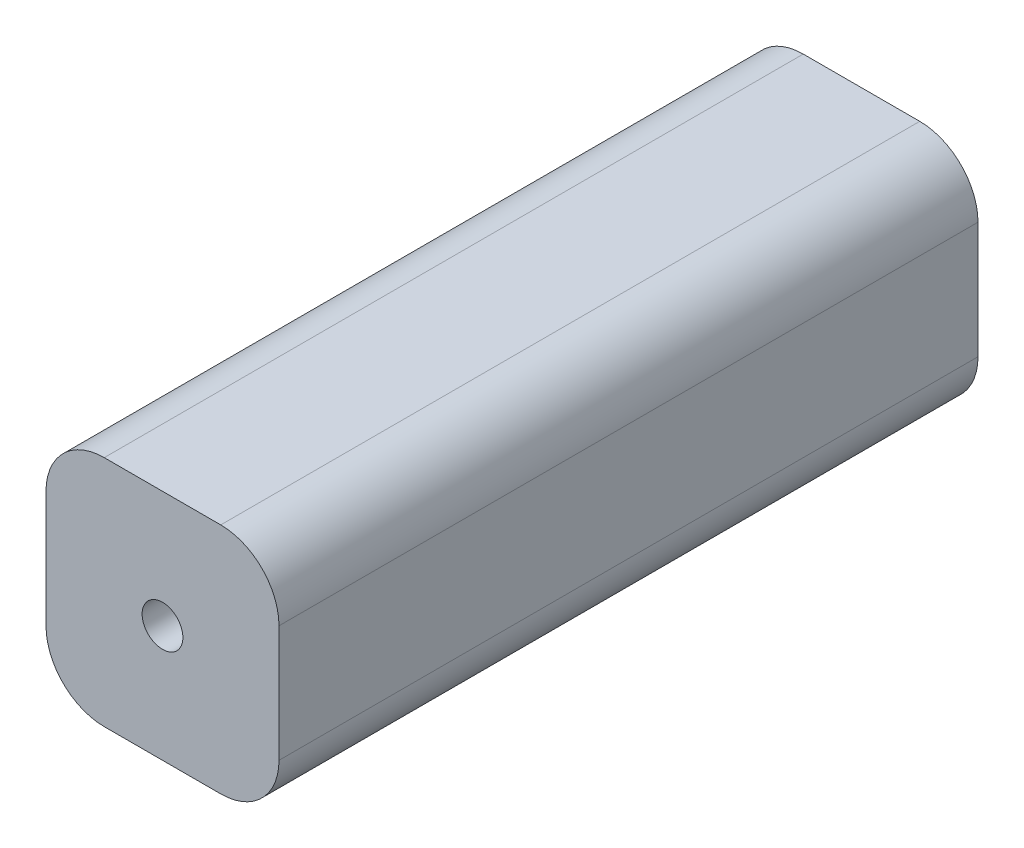
ISO-10303-21;
HEADER;
FILE_DESCRIPTION(('STEP AP214'),'2;1');
FILE_NAME('part.step','',(''),(''),'','','');
FILE_SCHEMA(('AUTOMOTIVE_DESIGN { 1 0 10303 214 1 1 1 1 }'));
ENDSEC;
DATA;
#1=APPLICATION_CONTEXT('core data for automotive mechanical design processes');
#2=APPLICATION_PROTOCOL_DEFINITION('international standard','automotive_design',2000,#1);
#3=PRODUCT_CONTEXT('',#1,'mechanical');
#4=PRODUCT('Part','Part','',(#3));
#5=PRODUCT_RELATED_PRODUCT_CATEGORY('part','',(#4));
#6=PRODUCT_DEFINITION_FORMATION('','',#4);
#7=PRODUCT_DEFINITION_CONTEXT('part definition',#1,'design');
#8=PRODUCT_DEFINITION('design','',#6,#7);
#9=PRODUCT_DEFINITION_SHAPE('','',#8);
#10=(LENGTH_UNIT() NAMED_UNIT(*) SI_UNIT(.MILLI.,.METRE.));
#11=(NAMED_UNIT(*) PLANE_ANGLE_UNIT() SI_UNIT($,.RADIAN.));
#12=(NAMED_UNIT(*) SI_UNIT($,.STERADIAN.) SOLID_ANGLE_UNIT());
#13=UNCERTAINTY_MEASURE_WITH_UNIT(LENGTH_MEASURE(1.E-05),#10,'distance_accuracy_value','');
#14=(GEOMETRIC_REPRESENTATION_CONTEXT(3) GLOBAL_UNCERTAINTY_ASSIGNED_CONTEXT((#13)) GLOBAL_UNIT_ASSIGNED_CONTEXT((#10,
#11,#12)) REPRESENTATION_CONTEXT('',''));
#15=CARTESIAN_POINT('',(0.,0.,0.));
#16=DIRECTION('',(0.,0.,1.));
#17=DIRECTION('',(1.,0.,0.));
#18=AXIS2_PLACEMENT_3D('',#15,#16,#17);
#19=CARTESIAN_POINT('',(0.,0.,60.));
#20=DIRECTION('',(-1.,0.,0.));
#21=DIRECTION('',(0.,0.,1.));
#22=AXIS2_PLACEMENT_3D('',#19,#20,#21);
#23=PLANE('',#22);
#24=DIRECTION('',(0.,1.,0.));
#25=VECTOR('',#24,1.);
#26=CARTESIAN_POINT('',(0.,0.,60.));
#27=LINE('',#26,#25);
#28=CARTESIAN_POINT('',(0.,5.,60.));
#29=VERTEX_POINT('',#28);
#30=CARTESIAN_POINT('',(0.,15.,60.));
#31=VERTEX_POINT('',#30);
#32=EDGE_CURVE('E126',#29,#31,#27,.T.);
#33=ORIENTED_EDGE('',*,*,#32,.F.);
#34=DIRECTION('',(0.,0.,-1.));
#35=VECTOR('',#34,1.);
#36=CARTESIAN_POINT('',(0.,5.,60.));
#37=LINE('',#36,#35);
#38=CARTESIAN_POINT('',(0.,5.,0.));
#39=VERTEX_POINT('',#38);
#40=EDGE_CURVE('E152',#29,#39,#37,.T.);
#41=ORIENTED_EDGE('',*,*,#40,.T.);
#42=DIRECTION('',(0.,1.,0.));
#43=VECTOR('',#42,1.);
#44=CARTESIAN_POINT('',(0.,0.,0.));
#45=LINE('',#44,#43);
#46=CARTESIAN_POINT('',(0.,15.,0.));
#47=VERTEX_POINT('',#46);
#48=EDGE_CURVE('E158',#39,#47,#45,.T.);
#49=ORIENTED_EDGE('',*,*,#48,.T.);
#50=DIRECTION('',(0.,0.,-1.));
#51=VECTOR('',#50,1.);
#52=CARTESIAN_POINT('',(0.,15.,60.));
#53=LINE('',#52,#51);
#54=EDGE_CURVE('E150',#47,#31,#53,.F.);
#55=ORIENTED_EDGE('',*,*,#54,.T.);
#56=EDGE_LOOP('',(#33,#41,#49,#55));
#57=FACE_BOUND('',#56,.T.);
#58=ADVANCED_FACE('F34',(#57),#23,.F.);
#59=CARTESIAN_POINT('',(0.,20.,60.));
#60=DIRECTION('',(0.,-1.,0.));
#61=DIRECTION('',(0.,0.,-1.));
#62=AXIS2_PLACEMENT_3D('',#59,#60,#61);
#63=PLANE('',#62);
#64=DIRECTION('',(-1.,0.,0.));
#65=VECTOR('',#64,1.);
#66=CARTESIAN_POINT('',(0.,20.,60.));
#67=LINE('',#66,#65);
#68=CARTESIAN_POINT('',(-5.,20.,60.));
#69=VERTEX_POINT('',#68);
#70=CARTESIAN_POINT('',(-15.,20.,60.));
#71=VERTEX_POINT('',#70);
#72=EDGE_CURVE('E129',#69,#71,#67,.T.);
#73=ORIENTED_EDGE('',*,*,#72,.F.);
#74=DIRECTION('',(0.,0.,-1.));
#75=VECTOR('',#74,1.);
#76=CARTESIAN_POINT('',(-5.,20.,60.));
#77=LINE('',#76,#75);
#78=CARTESIAN_POINT('',(-5.,20.,0.));
#79=VERTEX_POINT('',#78);
#80=EDGE_CURVE('E11',#69,#79,#77,.T.);
#81=ORIENTED_EDGE('',*,*,#80,.T.);
#82=DIRECTION('',(-1.,0.,0.));
#83=VECTOR('',#82,1.);
#84=CARTESIAN_POINT('',(0.,20.,0.));
#85=LINE('',#84,#83);
#86=CARTESIAN_POINT('',(-15.,20.,0.));
#87=VERTEX_POINT('',#86);
#88=EDGE_CURVE('E131',#79,#87,#85,.T.);
#89=ORIENTED_EDGE('',*,*,#88,.T.);
#90=DIRECTION('',(0.,0.,-1.));
#91=VECTOR('',#90,1.);
#92=CARTESIAN_POINT('',(-15.,20.,60.));
#93=LINE('',#92,#91);
#94=EDGE_CURVE('E42',#87,#71,#93,.F.);
#95=ORIENTED_EDGE('',*,*,#94,.T.);
#96=EDGE_LOOP('',(#73,#81,#89,#95));
#97=FACE_BOUND('',#96,.T.);
#98=ADVANCED_FACE('F206',(#97),#63,.F.);
#99=CARTESIAN_POINT('',(-20.,0.,60.));
#100=DIRECTION('',(1.,0.,0.));
#101=DIRECTION('',(0.,1.,0.));
#102=AXIS2_PLACEMENT_3D('',#99,#100,#101);
#103=PLANE('',#102);
#104=DIRECTION('',(0.,-1.,0.));
#105=VECTOR('',#104,1.);
#106=CARTESIAN_POINT('',(-20.,0.,0.));
#107=LINE('',#106,#105);
#108=CARTESIAN_POINT('',(-20.,15.,0.));
#109=VERTEX_POINT('',#108);
#110=CARTESIAN_POINT('',(-20.,5.,0.));
#111=VERTEX_POINT('',#110);
#112=EDGE_CURVE('E127',#109,#111,#107,.T.);
#113=ORIENTED_EDGE('',*,*,#112,.T.);
#114=DIRECTION('',(0.,0.,-1.));
#115=VECTOR('',#114,1.);
#116=CARTESIAN_POINT('',(-20.,5.,60.));
#117=LINE('',#116,#115);
#118=CARTESIAN_POINT('',(-20.,5.,60.));
#119=VERTEX_POINT('',#118);
#120=EDGE_CURVE('E105',#111,#119,#117,.F.);
#121=ORIENTED_EDGE('',*,*,#120,.T.);
#122=DIRECTION('',(0.,-1.,0.));
#123=VECTOR('',#122,1.);
#124=CARTESIAN_POINT('',(-20.,0.,60.));
#125=LINE('',#124,#123);
#126=CARTESIAN_POINT('',(-20.,15.,60.));
#127=VERTEX_POINT('',#126);
#128=EDGE_CURVE('E170',#127,#119,#125,.T.);
#129=ORIENTED_EDGE('',*,*,#128,.F.);
#130=DIRECTION('',(0.,0.,-1.));
#131=VECTOR('',#130,1.);
#132=CARTESIAN_POINT('',(-20.,15.,60.));
#133=LINE('',#132,#131);
#134=EDGE_CURVE('E110',#127,#109,#133,.T.);
#135=ORIENTED_EDGE('',*,*,#134,.T.);
#136=EDGE_LOOP('',(#113,#121,#129,#135));
#137=FACE_BOUND('',#136,.T.);
#138=ADVANCED_FACE('F211',(#137),#103,.F.);
#139=CARTESIAN_POINT('',(0.,0.,60.));
#140=DIRECTION('',(0.,1.,0.));
#141=DIRECTION('',(-1.,0.,0.));
#142=AXIS2_PLACEMENT_3D('',#139,#140,#141);
#143=PLANE('',#142);
#144=DIRECTION('',(1.,0.,0.));
#145=VECTOR('',#144,1.);
#146=CARTESIAN_POINT('',(0.,0.,60.));
#147=LINE('',#146,#145);
#148=CARTESIAN_POINT('',(-15.,0.,60.));
#149=VERTEX_POINT('',#148);
#150=CARTESIAN_POINT('',(-5.,0.,60.));
#151=VERTEX_POINT('',#150);
#152=EDGE_CURVE('E120',#149,#151,#147,.T.);
#153=ORIENTED_EDGE('',*,*,#152,.F.);
#154=DIRECTION('',(0.,0.,-1.));
#155=VECTOR('',#154,1.);
#156=CARTESIAN_POINT('',(-15.,0.,60.));
#157=LINE('',#156,#155);
#158=CARTESIAN_POINT('',(-15.,0.,0.));
#159=VERTEX_POINT('',#158);
#160=EDGE_CURVE('E104',#149,#159,#157,.T.);
#161=ORIENTED_EDGE('',*,*,#160,.T.);
#162=DIRECTION('',(1.,0.,0.));
#163=VECTOR('',#162,1.);
#164=CARTESIAN_POINT('',(0.,0.,0.));
#165=LINE('',#164,#163);
#166=CARTESIAN_POINT('',(-5.,0.,0.));
#167=VERTEX_POINT('',#166);
#168=EDGE_CURVE('E117',#159,#167,#165,.T.);
#169=ORIENTED_EDGE('',*,*,#168,.T.);
#170=DIRECTION('',(0.,0.,-1.));
#171=VECTOR('',#170,1.);
#172=CARTESIAN_POINT('',(-5.,0.,60.));
#173=LINE('',#172,#171);
#174=EDGE_CURVE('E122',#167,#151,#173,.F.);
#175=ORIENTED_EDGE('',*,*,#174,.T.);
#176=EDGE_LOOP('',(#153,#161,#169,#175));
#177=FACE_BOUND('',#176,.T.);
#178=ADVANCED_FACE('F116',(#177),#143,.F.);
#179=CARTESIAN_POINT('',(0.,0.,60.));
#180=DIRECTION('',(0.,0.,1.));
#181=DIRECTION('',(1.,0.,0.));
#182=AXIS2_PLACEMENT_3D('',#179,#180,#181);
#183=PLANE('',#182);
#184=CARTESIAN_POINT('',(-10.,10.,60.));
#185=DIRECTION('',(0.,0.,1.));
#186=DIRECTION('',(1.,0.,0.));
#187=AXIS2_PLACEMENT_3D('',#184,#185,#186);
#188=CIRCLE('',#187,1.75);
#189=CARTESIAN_POINT('',(-8.25,10.,60.));
#190=VERTEX_POINT('',#189);
#191=EDGE_CURVE('E166',#190,#190,#188,.T.);
#192=ORIENTED_EDGE('',*,*,#191,.F.);
#193=EDGE_LOOP('',(#192));
#194=FACE_BOUND('',#193,.T.);
#195=ORIENTED_EDGE('',*,*,#128,.T.);
#196=CARTESIAN_POINT('',(-15.,5.,60.));
#197=DIRECTION('',(0.,0.,1.));
#198=DIRECTION('',(1.,0.,0.));
#199=AXIS2_PLACEMENT_3D('',#196,#197,#198);
#200=CIRCLE('',#199,5.);
#201=EDGE_CURVE('E148',#119,#149,#200,.T.);
#202=ORIENTED_EDGE('',*,*,#201,.T.);
#203=ORIENTED_EDGE('',*,*,#152,.T.);
#204=CARTESIAN_POINT('',(-5.,5.,60.));
#205=DIRECTION('',(0.,0.,1.));
#206=DIRECTION('',(1.,0.,0.));
#207=AXIS2_PLACEMENT_3D('',#204,#205,#206);
#208=CIRCLE('',#207,5.);
#209=EDGE_CURVE('E146',#151,#29,#208,.T.);
#210=ORIENTED_EDGE('',*,*,#209,.T.);
#211=ORIENTED_EDGE('',*,*,#32,.T.);
#212=CARTESIAN_POINT('',(-5.,15.,60.));
#213=DIRECTION('',(0.,0.,1.));
#214=DIRECTION('',(1.,0.,0.));
#215=AXIS2_PLACEMENT_3D('',#212,#213,#214);
#216=CIRCLE('',#215,5.);
#217=EDGE_CURVE('E55',#31,#69,#216,.T.);
#218=ORIENTED_EDGE('',*,*,#217,.T.);
#219=ORIENTED_EDGE('',*,*,#72,.T.);
#220=CARTESIAN_POINT('',(-15.,15.,60.));
#221=DIRECTION('',(0.,0.,1.));
#222=DIRECTION('',(1.,0.,0.));
#223=AXIS2_PLACEMENT_3D('',#220,#221,#222);
#224=CIRCLE('',#223,5.);
#225=EDGE_CURVE('E143',#71,#127,#224,.T.);
#226=ORIENTED_EDGE('',*,*,#225,.T.);
#227=EDGE_LOOP('',(#195,#202,#203,#210,#211,#218,#219,#226));
#228=FACE_BOUND('',#227,.T.);
#229=ADVANCED_FACE('F194',(#194,#228),#183,.T.);
#230=CARTESIAN_POINT('',(0.,0.,0.));
#231=DIRECTION('',(0.,0.,1.));
#232=DIRECTION('',(1.,0.,0.));
#233=AXIS2_PLACEMENT_3D('',#230,#231,#232);
#234=PLANE('',#233);
#235=CARTESIAN_POINT('',(-10.,10.,0.));
#236=DIRECTION('',(0.,0.,-1.));
#237=DIRECTION('',(-1.,0.,0.));
#238=AXIS2_PLACEMENT_3D('',#235,#236,#237);
#239=CIRCLE('',#238,1.75);
#240=CARTESIAN_POINT('',(-11.75,10.,0.));
#241=VERTEX_POINT('',#240);
#242=EDGE_CURVE('E177',#241,#241,#239,.T.);
#243=ORIENTED_EDGE('',*,*,#242,.F.);
#244=EDGE_LOOP('',(#243));
#245=FACE_BOUND('',#244,.T.);
#246=ORIENTED_EDGE('',*,*,#168,.F.);
#247=CARTESIAN_POINT('',(-15.,5.,0.));
#248=DIRECTION('',(0.,0.,1.));
#249=DIRECTION('',(1.,0.,0.));
#250=AXIS2_PLACEMENT_3D('',#247,#248,#249);
#251=CIRCLE('',#250,5.);
#252=EDGE_CURVE('E100',#159,#111,#251,.F.);
#253=ORIENTED_EDGE('',*,*,#252,.T.);
#254=ORIENTED_EDGE('',*,*,#112,.F.);
#255=CARTESIAN_POINT('',(-15.,15.,0.));
#256=DIRECTION('',(0.,0.,1.));
#257=DIRECTION('',(1.,0.,0.));
#258=AXIS2_PLACEMENT_3D('',#255,#256,#257);
#259=CIRCLE('',#258,5.);
#260=EDGE_CURVE('E121',#109,#87,#259,.F.);
#261=ORIENTED_EDGE('',*,*,#260,.T.);
#262=ORIENTED_EDGE('',*,*,#88,.F.);
#263=CARTESIAN_POINT('',(-5.,15.,0.));
#264=DIRECTION('',(0.,0.,1.));
#265=DIRECTION('',(1.,0.,0.));
#266=AXIS2_PLACEMENT_3D('',#263,#264,#265);
#267=CIRCLE('',#266,5.);
#268=EDGE_CURVE('E137',#79,#47,#267,.F.);
#269=ORIENTED_EDGE('',*,*,#268,.T.);
#270=ORIENTED_EDGE('',*,*,#48,.F.);
#271=CARTESIAN_POINT('',(-5.,5.,0.));
#272=DIRECTION('',(0.,0.,1.));
#273=DIRECTION('',(1.,0.,0.));
#274=AXIS2_PLACEMENT_3D('',#271,#272,#273);
#275=CIRCLE('',#274,5.);
#276=EDGE_CURVE('E111',#39,#167,#275,.F.);
#277=ORIENTED_EDGE('',*,*,#276,.T.);
#278=EDGE_LOOP('',(#246,#253,#254,#261,#262,#269,#270,#277));
#279=FACE_BOUND('',#278,.T.);
#280=ADVANCED_FACE('F124',(#245,#279),#234,.F.);
#281=CARTESIAN_POINT('',(-10.,10.,45.));
#282=DIRECTION('',(0.,0.,1.));
#283=DIRECTION('',(1.,0.,0.));
#284=AXIS2_PLACEMENT_3D('',#281,#282,#283);
#285=CYLINDRICAL_SURFACE('',#284,1.75);
#286=CARTESIAN_POINT('',(-10.,10.,45.));
#287=DIRECTION('',(0.,0.,1.));
#288=DIRECTION('',(1.,0.,0.));
#289=AXIS2_PLACEMENT_3D('',#286,#287,#288);
#290=CIRCLE('',#289,1.75);
#291=CARTESIAN_POINT('',(-8.25,10.,45.));
#292=VERTEX_POINT('',#291);
#293=EDGE_CURVE('E163',#292,#292,#290,.T.);
#294=ORIENTED_EDGE('',*,*,#293,.F.);
#295=EDGE_LOOP('',(#294));
#296=FACE_BOUND('',#295,.T.);
#297=ORIENTED_EDGE('',*,*,#191,.T.);
#298=EDGE_LOOP('',(#297));
#299=FACE_BOUND('',#298,.T.);
#300=ADVANCED_FACE('F193',(#296,#299),#285,.F.);
#301=CARTESIAN_POINT('',(-10.,10.,45.));
#302=DIRECTION('',(0.,0.,1.));
#303=DIRECTION('',(1.,0.,0.));
#304=AXIS2_PLACEMENT_3D('',#301,#302,#303);
#305=PLANE('',#304);
#306=ORIENTED_EDGE('',*,*,#293,.T.);
#307=EDGE_LOOP('',(#306));
#308=FACE_BOUND('',#307,.T.);
#309=ADVANCED_FACE('F188',(#308),#305,.T.);
#310=CARTESIAN_POINT('',(-10.,10.,15.));
#311=DIRECTION('',(0.,0.,-1.));
#312=DIRECTION('',(-1.,0.,0.));
#313=AXIS2_PLACEMENT_3D('',#310,#311,#312);
#314=CYLINDRICAL_SURFACE('',#313,1.75);
#315=CARTESIAN_POINT('',(-10.,10.,15.));
#316=DIRECTION('',(0.,0.,-1.));
#317=DIRECTION('',(-1.,0.,0.));
#318=AXIS2_PLACEMENT_3D('',#315,#316,#317);
#319=CIRCLE('',#318,1.75);
#320=CARTESIAN_POINT('',(-11.75,10.,15.));
#321=VERTEX_POINT('',#320);
#322=EDGE_CURVE('E175',#321,#321,#319,.T.);
#323=ORIENTED_EDGE('',*,*,#322,.F.);
#324=EDGE_LOOP('',(#323));
#325=FACE_BOUND('',#324,.T.);
#326=ORIENTED_EDGE('',*,*,#242,.T.);
#327=EDGE_LOOP('',(#326));
#328=FACE_BOUND('',#327,.T.);
#329=ADVANCED_FACE('F185',(#325,#328),#314,.F.);
#330=CARTESIAN_POINT('',(-10.,10.,15.));
#331=DIRECTION('',(0.,0.,-1.));
#332=DIRECTION('',(-1.,0.,0.));
#333=AXIS2_PLACEMENT_3D('',#330,#331,#332);
#334=PLANE('',#333);
#335=ORIENTED_EDGE('',*,*,#322,.T.);
#336=EDGE_LOOP('',(#335));
#337=FACE_BOUND('',#336,.T.);
#338=ADVANCED_FACE('F183',(#337),#334,.T.);
#339=CARTESIAN_POINT('',(-15.,5.,60.));
#340=DIRECTION('',(0.,0.,-1.));
#341=DIRECTION('',(-1.,0.,0.));
#342=AXIS2_PLACEMENT_3D('',#339,#340,#341);
#343=CYLINDRICAL_SURFACE('',#342,5.);
#344=ORIENTED_EDGE('',*,*,#201,.F.);
#345=ORIENTED_EDGE('',*,*,#120,.F.);
#346=ORIENTED_EDGE('',*,*,#252,.F.);
#347=ORIENTED_EDGE('',*,*,#160,.F.);
#348=EDGE_LOOP('',(#344,#345,#346,#347));
#349=FACE_BOUND('',#348,.T.);
#350=ADVANCED_FACE('F103',(#349),#343,.T.);
#351=CARTESIAN_POINT('',(-5.,5.,60.));
#352=DIRECTION('',(0.,0.,-1.));
#353=DIRECTION('',(-1.,0.,0.));
#354=AXIS2_PLACEMENT_3D('',#351,#352,#353);
#355=CYLINDRICAL_SURFACE('',#354,5.);
#356=ORIENTED_EDGE('',*,*,#209,.F.);
#357=ORIENTED_EDGE('',*,*,#174,.F.);
#358=ORIENTED_EDGE('',*,*,#276,.F.);
#359=ORIENTED_EDGE('',*,*,#40,.F.);
#360=EDGE_LOOP('',(#356,#357,#358,#359));
#361=FACE_BOUND('',#360,.T.);
#362=ADVANCED_FACE('F217',(#361),#355,.T.);
#363=CARTESIAN_POINT('',(-5.,15.,60.));
#364=DIRECTION('',(0.,0.,-1.));
#365=DIRECTION('',(-1.,0.,0.));
#366=AXIS2_PLACEMENT_3D('',#363,#364,#365);
#367=CYLINDRICAL_SURFACE('',#366,5.);
#368=ORIENTED_EDGE('',*,*,#217,.F.);
#369=ORIENTED_EDGE('',*,*,#54,.F.);
#370=ORIENTED_EDGE('',*,*,#268,.F.);
#371=ORIENTED_EDGE('',*,*,#80,.F.);
#372=EDGE_LOOP('',(#368,#369,#370,#371));
#373=FACE_BOUND('',#372,.T.);
#374=ADVANCED_FACE('F219',(#373),#367,.T.);
#375=CARTESIAN_POINT('',(-15.,15.,60.));
#376=DIRECTION('',(0.,0.,-1.));
#377=DIRECTION('',(-1.,0.,0.));
#378=AXIS2_PLACEMENT_3D('',#375,#376,#377);
#379=CYLINDRICAL_SURFACE('',#378,5.);
#380=ORIENTED_EDGE('',*,*,#225,.F.);
#381=ORIENTED_EDGE('',*,*,#94,.F.);
#382=ORIENTED_EDGE('',*,*,#260,.F.);
#383=ORIENTED_EDGE('',*,*,#134,.F.);
#384=EDGE_LOOP('',(#380,#381,#382,#383));
#385=FACE_BOUND('',#384,.T.);
#386=ADVANCED_FACE('F36',(#385),#379,.T.);
#387=CLOSED_SHELL('',(#58,#98,#138,#178,#229,#280,#300,#309,#329,#338,#350,#362,#374,#386));
#388=MANIFOLD_SOLID_BREP('B2',#387);
#389=ADVANCED_BREP_SHAPE_REPRESENTATION('',(#18,#388),#14);
#390=SHAPE_DEFINITION_REPRESENTATION(#9,#389);
ENDSEC;
END-ISO-10303-21;
